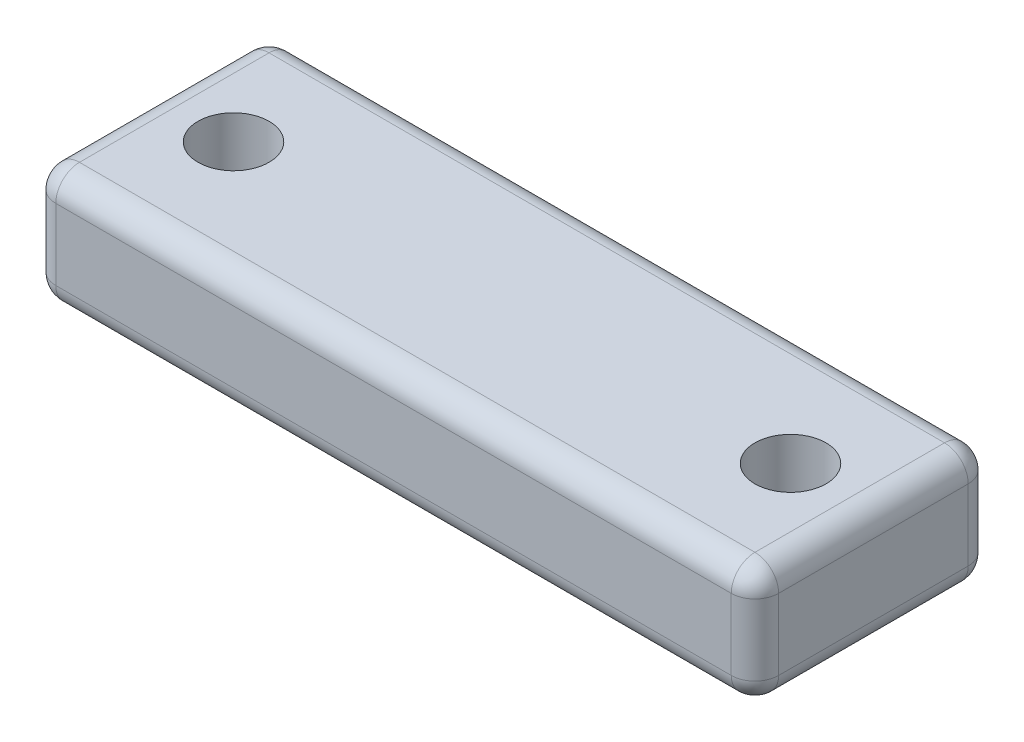
ISO-10303-21;
HEADER;
FILE_DESCRIPTION(('STEP AP214'),'2;1');
FILE_NAME('part.step','',(''),(''),'','','');
FILE_SCHEMA(('AUTOMOTIVE_DESIGN { 1 0 10303 214 1 1 1 1 }'));
ENDSEC;
DATA;
#1=APPLICATION_CONTEXT('core data for automotive mechanical design processes');
#2=APPLICATION_PROTOCOL_DEFINITION('international standard','automotive_design',2000,#1);
#3=PRODUCT_CONTEXT('',#1,'mechanical');
#4=PRODUCT('Part','Part','',(#3));
#5=PRODUCT_RELATED_PRODUCT_CATEGORY('part','',(#4));
#6=PRODUCT_DEFINITION_FORMATION('','',#4);
#7=PRODUCT_DEFINITION_CONTEXT('part definition',#1,'design');
#8=PRODUCT_DEFINITION('design','',#6,#7);
#9=PRODUCT_DEFINITION_SHAPE('','',#8);
#10=(LENGTH_UNIT() NAMED_UNIT(*) SI_UNIT(.MILLI.,.METRE.));
#11=(NAMED_UNIT(*) PLANE_ANGLE_UNIT() SI_UNIT($,.RADIAN.));
#12=(NAMED_UNIT(*) SI_UNIT($,.STERADIAN.) SOLID_ANGLE_UNIT());
#13=UNCERTAINTY_MEASURE_WITH_UNIT(LENGTH_MEASURE(1.E-05),#10,'distance_accuracy_value','');
#14=(GEOMETRIC_REPRESENTATION_CONTEXT(3) GLOBAL_UNCERTAINTY_ASSIGNED_CONTEXT((#13)) GLOBAL_UNIT_ASSIGNED_CONTEXT((#10,
#11,#12)) REPRESENTATION_CONTEXT('',''));
#15=CARTESIAN_POINT('',(0.,0.,0.));
#16=DIRECTION('',(0.,0.,1.));
#17=DIRECTION('',(1.,0.,0.));
#18=AXIS2_PLACEMENT_3D('',#15,#16,#17);
#19=CARTESIAN_POINT('',(0.,5.,0.));
#20=DIRECTION('',(-1.,0.,0.));
#21=DIRECTION('',(0.,0.,1.));
#22=AXIS2_PLACEMENT_3D('',#19,#20,#21);
#23=PLANE('',#22);
#24=DIRECTION('',(0.,0.,-1.));
#25=VECTOR('',#24,1.);
#26=CARTESIAN_POINT('',(0.,1.,0.));
#27=LINE('',#26,#25);
#28=CARTESIAN_POINT('',(0.,1.,-1.));
#29=VERTEX_POINT('',#28);
#30=CARTESIAN_POINT('',(0.,1.,-9.));
#31=VERTEX_POINT('',#30);
#32=EDGE_CURVE('E175',#29,#31,#27,.T.);
#33=ORIENTED_EDGE('',*,*,#32,.T.);
#34=DIRECTION('',(0.,-1.,0.));
#35=VECTOR('',#34,1.);
#36=CARTESIAN_POINT('',(0.,5.,-9.));
#37=LINE('',#36,#35);
#38=CARTESIAN_POINT('',(0.,4.,-9.));
#39=VERTEX_POINT('',#38);
#40=EDGE_CURVE('E180',#31,#39,#37,.F.);
#41=ORIENTED_EDGE('',*,*,#40,.T.);
#42=DIRECTION('',(0.,0.,-1.));
#43=VECTOR('',#42,1.);
#44=CARTESIAN_POINT('',(0.,4.,0.));
#45=LINE('',#44,#43);
#46=CARTESIAN_POINT('',(0.,4.,-1.));
#47=VERTEX_POINT('',#46);
#48=EDGE_CURVE('E177',#39,#47,#45,.F.);
#49=ORIENTED_EDGE('',*,*,#48,.T.);
#50=DIRECTION('',(0.,-1.,0.));
#51=VECTOR('',#50,1.);
#52=CARTESIAN_POINT('',(0.,5.,-1.));
#53=LINE('',#52,#51);
#54=EDGE_CURVE('E173',#47,#29,#53,.T.);
#55=ORIENTED_EDGE('',*,*,#54,.T.);
#56=EDGE_LOOP('',(#33,#41,#49,#55));
#57=FACE_BOUND('',#56,.T.);
#58=ADVANCED_FACE('F39',(#57),#23,.F.);
#59=CARTESIAN_POINT('',(0.,5.,-10.));
#60=DIRECTION('',(0.,0.,1.));
#61=DIRECTION('',(1.,0.,0.));
#62=AXIS2_PLACEMENT_3D('',#59,#60,#61);
#63=PLANE('',#62);
#64=DIRECTION('',(-1.,0.,0.));
#65=VECTOR('',#64,1.);
#66=CARTESIAN_POINT('',(0.,4.,-10.));
#67=LINE('',#66,#65);
#68=CARTESIAN_POINT('',(-29.5,4.,-10.));
#69=VERTEX_POINT('',#68);
#70=CARTESIAN_POINT('',(-1.,4.,-10.));
#71=VERTEX_POINT('',#70);
#72=EDGE_CURVE('E195',#69,#71,#67,.F.);
#73=ORIENTED_EDGE('',*,*,#72,.T.);
#74=DIRECTION('',(0.,-1.,0.));
#75=VECTOR('',#74,1.);
#76=CARTESIAN_POINT('',(-1.,5.,-10.));
#77=LINE('',#76,#75);
#78=CARTESIAN_POINT('',(-1.,1.,-10.));
#79=VERTEX_POINT('',#78);
#80=EDGE_CURVE('E197',#71,#79,#77,.T.);
#81=ORIENTED_EDGE('',*,*,#80,.T.);
#82=DIRECTION('',(-1.,0.,0.));
#83=VECTOR('',#82,1.);
#84=CARTESIAN_POINT('',(0.,1.,-10.));
#85=LINE('',#84,#83);
#86=CARTESIAN_POINT('',(-29.5,1.,-10.));
#87=VERTEX_POINT('',#86);
#88=EDGE_CURVE('E193',#79,#87,#85,.T.);
#89=ORIENTED_EDGE('',*,*,#88,.T.);
#90=DIRECTION('',(0.,-1.,0.));
#91=VECTOR('',#90,1.);
#92=CARTESIAN_POINT('',(-29.5,5.,-10.));
#93=LINE('',#92,#91);
#94=EDGE_CURVE('E191',#87,#69,#93,.F.);
#95=ORIENTED_EDGE('',*,*,#94,.T.);
#96=EDGE_LOOP('',(#73,#81,#89,#95));
#97=FACE_BOUND('',#96,.T.);
#98=ADVANCED_FACE('F298',(#97),#63,.F.);
#99=CARTESIAN_POINT('',(-30.5,5.,0.));
#100=DIRECTION('',(1.,0.,0.));
#101=DIRECTION('',(0.,0.,-1.));
#102=AXIS2_PLACEMENT_3D('',#99,#100,#101);
#103=PLANE('',#102);
#104=DIRECTION('',(0.,0.,1.));
#105=VECTOR('',#104,1.);
#106=CARTESIAN_POINT('',(-30.5,4.,-10.));
#107=LINE('',#106,#105);
#108=CARTESIAN_POINT('',(-30.5,4.,-0.999999999999997));
#109=VERTEX_POINT('',#108);
#110=CARTESIAN_POINT('',(-30.5,4.,-9.));
#111=VERTEX_POINT('',#110);
#112=EDGE_CURVE('E145',#109,#111,#107,.F.);
#113=ORIENTED_EDGE('',*,*,#112,.T.);
#114=DIRECTION('',(0.,-1.,0.));
#115=VECTOR('',#114,1.);
#116=CARTESIAN_POINT('',(-30.5,5.,-9.));
#117=LINE('',#116,#115);
#118=CARTESIAN_POINT('',(-30.5,1.,-9.));
#119=VERTEX_POINT('',#118);
#120=EDGE_CURVE('E205',#111,#119,#117,.T.);
#121=ORIENTED_EDGE('',*,*,#120,.T.);
#122=DIRECTION('',(0.,0.,1.));
#123=VECTOR('',#122,1.);
#124=CARTESIAN_POINT('',(-30.5,1.,0.));
#125=LINE('',#124,#123);
#126=CARTESIAN_POINT('',(-30.5,1.,-0.999999999999997));
#127=VERTEX_POINT('',#126);
#128=EDGE_CURVE('E202',#119,#127,#125,.T.);
#129=ORIENTED_EDGE('',*,*,#128,.T.);
#130=DIRECTION('',(0.,-1.,0.));
#131=VECTOR('',#130,1.);
#132=CARTESIAN_POINT('',(-30.5,5.,-0.999999999999997));
#133=LINE('',#132,#131);
#134=EDGE_CURVE('E200',#127,#109,#133,.F.);
#135=ORIENTED_EDGE('',*,*,#134,.T.);
#136=EDGE_LOOP('',(#113,#121,#129,#135));
#137=FACE_BOUND('',#136,.T.);
#138=ADVANCED_FACE('F294',(#137),#103,.F.);
#139=CARTESIAN_POINT('',(0.,5.,0.));
#140=DIRECTION('',(0.,0.,-1.));
#141=DIRECTION('',(-1.,0.,0.));
#142=AXIS2_PLACEMENT_3D('',#139,#140,#141);
#143=PLANE('',#142);
#144=DIRECTION('',(1.,0.,0.));
#145=VECTOR('',#144,1.);
#146=CARTESIAN_POINT('',(-30.5,4.,0.));
#147=LINE('',#146,#145);
#148=CARTESIAN_POINT('',(-1.,4.,0.));
#149=VERTEX_POINT('',#148);
#150=CARTESIAN_POINT('',(-29.5,4.,0.));
#151=VERTEX_POINT('',#150);
#152=EDGE_CURVE('E48',#149,#151,#147,.F.);
#153=ORIENTED_EDGE('',*,*,#152,.T.);
#154=DIRECTION('',(0.,-1.,0.));
#155=VECTOR('',#154,1.);
#156=CARTESIAN_POINT('',(-29.5,5.,0.));
#157=LINE('',#156,#155);
#158=CARTESIAN_POINT('',(-29.5,1.,0.));
#159=VERTEX_POINT('',#158);
#160=EDGE_CURVE('E11',#151,#159,#157,.T.);
#161=ORIENTED_EDGE('',*,*,#160,.T.);
#162=DIRECTION('',(1.,0.,0.));
#163=VECTOR('',#162,1.);
#164=CARTESIAN_POINT('',(0.,1.,0.));
#165=LINE('',#164,#163);
#166=CARTESIAN_POINT('',(-1.,1.,0.));
#167=VERTEX_POINT('',#166);
#168=EDGE_CURVE('E208',#159,#167,#165,.T.);
#169=ORIENTED_EDGE('',*,*,#168,.T.);
#170=DIRECTION('',(0.,-1.,0.));
#171=VECTOR('',#170,1.);
#172=CARTESIAN_POINT('',(-1.,5.,0.));
#173=LINE('',#172,#171);
#174=EDGE_CURVE('E59',#167,#149,#173,.F.);
#175=ORIENTED_EDGE('',*,*,#174,.T.);
#176=EDGE_LOOP('',(#153,#161,#169,#175));
#177=FACE_BOUND('',#176,.T.);
#178=ADVANCED_FACE('F286',(#177),#143,.F.);
#179=CARTESIAN_POINT('',(0.,5.,0.));
#180=DIRECTION('',(0.,1.,0.));
#181=DIRECTION('',(0.,0.,1.));
#182=AXIS2_PLACEMENT_3D('',#179,#180,#181);
#183=PLANE('',#182);
#184=DIRECTION('',(1.,0.,0.));
#185=VECTOR('',#184,1.);
#186=CARTESIAN_POINT('',(0.,5.,-1.));
#187=LINE('',#186,#185);
#188=CARTESIAN_POINT('',(-29.5,5.,-0.999999999999997));
#189=VERTEX_POINT('',#188);
#190=CARTESIAN_POINT('',(-1.,5.,-1.));
#191=VERTEX_POINT('',#190);
#192=EDGE_CURVE('E132',#189,#191,#187,.T.);
#193=ORIENTED_EDGE('',*,*,#192,.T.);
#194=DIRECTION('',(0.,0.,-1.));
#195=VECTOR('',#194,1.);
#196=CARTESIAN_POINT('',(-1.,5.,-10.));
#197=LINE('',#196,#195);
#198=CARTESIAN_POINT('',(-1.,5.,-9.));
#199=VERTEX_POINT('',#198);
#200=EDGE_CURVE('E171',#191,#199,#197,.T.);
#201=ORIENTED_EDGE('',*,*,#200,.T.);
#202=DIRECTION('',(-1.,0.,0.));
#203=VECTOR('',#202,1.);
#204=CARTESIAN_POINT('',(-30.5,5.,-9.));
#205=LINE('',#204,#203);
#206=CARTESIAN_POINT('',(-29.5,5.,-9.));
#207=VERTEX_POINT('',#206);
#208=EDGE_CURVE('E135',#199,#207,#205,.T.);
#209=ORIENTED_EDGE('',*,*,#208,.T.);
#210=DIRECTION('',(0.,0.,1.));
#211=VECTOR('',#210,1.);
#212=CARTESIAN_POINT('',(-29.5,5.,0.));
#213=LINE('',#212,#211);
#214=EDGE_CURVE('E126',#207,#189,#213,.T.);
#215=ORIENTED_EDGE('',*,*,#214,.T.);
#216=EDGE_LOOP('',(#193,#201,#209,#215));
#217=FACE_BOUND('',#216,.T.);
#218=CARTESIAN_POINT('',(-27.,5.,-5.));
#219=DIRECTION('',(0.,1.,0.));
#220=DIRECTION('',(0.,0.,1.));
#221=AXIS2_PLACEMENT_3D('',#218,#219,#220);
#222=CIRCLE('',#221,1.5);
#223=CARTESIAN_POINT('',(-27.,5.,-3.5));
#224=VERTEX_POINT('',#223);
#225=EDGE_CURVE('E163',#224,#224,#222,.T.);
#226=ORIENTED_EDGE('',*,*,#225,.F.);
#227=EDGE_LOOP('',(#226));
#228=FACE_BOUND('',#227,.T.);
#229=CARTESIAN_POINT('',(-3.5,5.,-5.));
#230=DIRECTION('',(0.,1.,0.));
#231=DIRECTION('',(0.,0.,1.));
#232=AXIS2_PLACEMENT_3D('',#229,#230,#231);
#233=CIRCLE('',#232,1.5);
#234=CARTESIAN_POINT('',(-3.5,5.,-3.5));
#235=VERTEX_POINT('',#234);
#236=EDGE_CURVE('E166',#235,#235,#233,.T.);
#237=ORIENTED_EDGE('',*,*,#236,.F.);
#238=EDGE_LOOP('',(#237));
#239=FACE_BOUND('',#238,.T.);
#240=ADVANCED_FACE('F128',(#217,#228,#239),#183,.T.);
#241=CARTESIAN_POINT('',(0.,0.,0.));
#242=DIRECTION('',(0.,1.,0.));
#243=DIRECTION('',(0.,0.,1.));
#244=AXIS2_PLACEMENT_3D('',#241,#242,#243);
#245=PLANE('',#244);
#246=DIRECTION('',(-1.,0.,0.));
#247=VECTOR('',#246,1.);
#248=CARTESIAN_POINT('',(0.,0.,-9.));
#249=LINE('',#248,#247);
#250=CARTESIAN_POINT('',(-29.5,0.,-9.));
#251=VERTEX_POINT('',#250);
#252=CARTESIAN_POINT('',(-1.,0.,-9.));
#253=VERTEX_POINT('',#252);
#254=EDGE_CURVE('E186',#251,#253,#249,.F.);
#255=ORIENTED_EDGE('',*,*,#254,.T.);
#256=DIRECTION('',(0.,0.,-1.));
#257=VECTOR('',#256,1.);
#258=CARTESIAN_POINT('',(-1.,0.,0.));
#259=LINE('',#258,#257);
#260=CARTESIAN_POINT('',(-1.,0.,-1.));
#261=VERTEX_POINT('',#260);
#262=EDGE_CURVE('E188',#253,#261,#259,.F.);
#263=ORIENTED_EDGE('',*,*,#262,.T.);
#264=DIRECTION('',(1.,0.,0.));
#265=VECTOR('',#264,1.);
#266=CARTESIAN_POINT('',(0.,0.,-1.));
#267=LINE('',#266,#265);
#268=CARTESIAN_POINT('',(-29.5,0.,-0.999999999999997));
#269=VERTEX_POINT('',#268);
#270=EDGE_CURVE('E182',#261,#269,#267,.F.);
#271=ORIENTED_EDGE('',*,*,#270,.T.);
#272=DIRECTION('',(0.,0.,1.));
#273=VECTOR('',#272,1.);
#274=CARTESIAN_POINT('',(-29.5,0.,0.));
#275=LINE('',#274,#273);
#276=EDGE_CURVE('E184',#269,#251,#275,.F.);
#277=ORIENTED_EDGE('',*,*,#276,.T.);
#278=EDGE_LOOP('',(#255,#263,#271,#277));
#279=FACE_BOUND('',#278,.T.);
#280=CARTESIAN_POINT('',(-27.,0.,-5.));
#281=DIRECTION('',(0.,1.,0.));
#282=DIRECTION('',(0.,0.,1.));
#283=AXIS2_PLACEMENT_3D('',#280,#281,#282);
#284=CIRCLE('',#283,1.5);
#285=CARTESIAN_POINT('',(-27.,0.,-3.5));
#286=VERTEX_POINT('',#285);
#287=EDGE_CURVE('E272',#286,#286,#284,.T.);
#288=ORIENTED_EDGE('',*,*,#287,.T.);
#289=EDGE_LOOP('',(#288));
#290=FACE_BOUND('',#289,.T.);
#291=CARTESIAN_POINT('',(-3.5,0.,-5.));
#292=DIRECTION('',(0.,1.,0.));
#293=DIRECTION('',(0.,0.,1.));
#294=AXIS2_PLACEMENT_3D('',#291,#292,#293);
#295=CIRCLE('',#294,1.5);
#296=CARTESIAN_POINT('',(-3.5,0.,-3.5));
#297=VERTEX_POINT('',#296);
#298=EDGE_CURVE('E266',#297,#297,#295,.T.);
#299=ORIENTED_EDGE('',*,*,#298,.T.);
#300=EDGE_LOOP('',(#299));
#301=FACE_BOUND('',#300,.T.);
#302=ADVANCED_FACE('F285',(#279,#290,#301),#245,.F.);
#303=CARTESIAN_POINT('',(-3.5,0.,-5.));
#304=DIRECTION('',(0.,1.,0.));
#305=DIRECTION('',(0.,0.,1.));
#306=AXIS2_PLACEMENT_3D('',#303,#304,#305);
#307=CYLINDRICAL_SURFACE('',#306,1.5);
#308=ORIENTED_EDGE('',*,*,#236,.T.);
#309=EDGE_LOOP('',(#308));
#310=FACE_BOUND('',#309,.T.);
#311=ORIENTED_EDGE('',*,*,#298,.F.);
#312=EDGE_LOOP('',(#311));
#313=FACE_BOUND('',#312,.T.);
#314=ADVANCED_FACE('F281',(#310,#313),#307,.F.);
#315=CARTESIAN_POINT('',(-27.,0.,-5.));
#316=DIRECTION('',(0.,1.,0.));
#317=DIRECTION('',(0.,0.,1.));
#318=AXIS2_PLACEMENT_3D('',#315,#316,#317);
#319=CYLINDRICAL_SURFACE('',#318,1.5);
#320=ORIENTED_EDGE('',*,*,#225,.T.);
#321=EDGE_LOOP('',(#320));
#322=FACE_BOUND('',#321,.T.);
#323=ORIENTED_EDGE('',*,*,#287,.F.);
#324=EDGE_LOOP('',(#323));
#325=FACE_BOUND('',#324,.T.);
#326=ADVANCED_FACE('F378',(#322,#325),#319,.F.);
#327=CARTESIAN_POINT('',(-29.5,1.,0.));
#328=DIRECTION('',(0.,0.,1.));
#329=DIRECTION('',(1.,0.,0.));
#330=AXIS2_PLACEMENT_3D('',#327,#328,#329);
#331=CYLINDRICAL_SURFACE('',#330,1.);
#332=CARTESIAN_POINT('',(-29.5,1.,-0.999999999999997));
#333=DIRECTION('',(0.,0.,1.));
#334=DIRECTION('',(0.,-1.,0.));
#335=AXIS2_PLACEMENT_3D('',#332,#333,#334);
#336=CIRCLE('',#335,1.);
#337=EDGE_CURVE('E43',#127,#269,#336,.T.);
#338=ORIENTED_EDGE('',*,*,#337,.F.);
#339=ORIENTED_EDGE('',*,*,#128,.F.);
#340=CARTESIAN_POINT('',(-29.5,1.,-9.));
#341=DIRECTION('',(0.,0.,-1.));
#342=DIRECTION('',(-1.,0.,0.));
#343=AXIS2_PLACEMENT_3D('',#340,#341,#342);
#344=CIRCLE('',#343,1.);
#345=EDGE_CURVE('E258',#251,#119,#344,.T.);
#346=ORIENTED_EDGE('',*,*,#345,.F.);
#347=ORIENTED_EDGE('',*,*,#276,.F.);
#348=EDGE_LOOP('',(#338,#339,#346,#347));
#349=FACE_BOUND('',#348,.T.);
#350=ADVANCED_FACE('F41',(#349),#331,.T.);
#351=CARTESIAN_POINT('',(-29.5,1.,-0.999999999999997));
#352=DIRECTION('',(0.,-1.,0.));
#353=DIRECTION('',(0.,0.,-1.));
#354=AXIS2_PLACEMENT_3D('',#351,#352,#353);
#355=SPHERICAL_SURFACE('',#354,1.);
#356=CARTESIAN_POINT('',(-29.5,1.,-0.999999999999997));
#357=DIRECTION('',(0.,-1.,0.));
#358=DIRECTION('',(0.,0.,-1.));
#359=AXIS2_PLACEMENT_3D('',#356,#357,#358);
#360=CIRCLE('',#359,1.);
#361=EDGE_CURVE('E253',#127,#159,#360,.F.);
#362=ORIENTED_EDGE('',*,*,#361,.F.);
#363=ORIENTED_EDGE('',*,*,#337,.T.);
#364=CARTESIAN_POINT('',(-29.5,1.,-0.999999999999997));
#365=DIRECTION('',(-1.,0.,0.));
#366=DIRECTION('',(0.,0.,1.));
#367=AXIS2_PLACEMENT_3D('',#364,#365,#366);
#368=CIRCLE('',#367,1.);
#369=EDGE_CURVE('E256',#159,#269,#368,.F.);
#370=ORIENTED_EDGE('',*,*,#369,.F.);
#371=EDGE_LOOP('',(#362,#363,#370));
#372=FACE_BOUND('',#371,.T.);
#373=ADVANCED_FACE('F373',(#372),#355,.T.);
#374=CARTESIAN_POINT('',(-29.5,1.,-9.));
#375=DIRECTION('',(-1.,0.,0.));
#376=DIRECTION('',(0.,0.,1.));
#377=AXIS2_PLACEMENT_3D('',#374,#375,#376);
#378=SPHERICAL_SURFACE('',#377,1.);
#379=CARTESIAN_POINT('',(-29.5,1.,-9.));
#380=DIRECTION('',(-1.,0.,0.));
#381=DIRECTION('',(0.,0.,1.));
#382=AXIS2_PLACEMENT_3D('',#379,#380,#381);
#383=CIRCLE('',#382,1.);
#384=EDGE_CURVE('E248',#251,#87,#383,.F.);
#385=ORIENTED_EDGE('',*,*,#384,.F.);
#386=ORIENTED_EDGE('',*,*,#345,.T.);
#387=CARTESIAN_POINT('',(-29.5,1.,-9.));
#388=DIRECTION('',(0.,-1.,0.));
#389=DIRECTION('',(0.,0.,-1.));
#390=AXIS2_PLACEMENT_3D('',#387,#388,#389);
#391=CIRCLE('',#390,1.);
#392=EDGE_CURVE('E251',#87,#119,#391,.F.);
#393=ORIENTED_EDGE('',*,*,#392,.F.);
#394=EDGE_LOOP('',(#385,#386,#393));
#395=FACE_BOUND('',#394,.T.);
#396=ADVANCED_FACE('F370',(#395),#378,.T.);
#397=CARTESIAN_POINT('',(0.,1.,-1.));
#398=DIRECTION('',(1.,0.,0.));
#399=DIRECTION('',(0.,0.,-1.));
#400=AXIS2_PLACEMENT_3D('',#397,#398,#399);
#401=CYLINDRICAL_SURFACE('',#400,1.);
#402=ORIENTED_EDGE('',*,*,#369,.T.);
#403=ORIENTED_EDGE('',*,*,#270,.F.);
#404=CARTESIAN_POINT('',(-1.,1.,-1.));
#405=DIRECTION('',(1.,0.,0.));
#406=DIRECTION('',(0.,0.,-1.));
#407=AXIS2_PLACEMENT_3D('',#404,#405,#406);
#408=CIRCLE('',#407,1.);
#409=EDGE_CURVE('E243',#167,#261,#408,.T.);
#410=ORIENTED_EDGE('',*,*,#409,.F.);
#411=ORIENTED_EDGE('',*,*,#168,.F.);
#412=EDGE_LOOP('',(#402,#403,#410,#411));
#413=FACE_BOUND('',#412,.T.);
#414=ADVANCED_FACE('F366',(#413),#401,.T.);
#415=CARTESIAN_POINT('',(-29.5,5.,-0.999999999999997));
#416=DIRECTION('',(0.,-1.,0.));
#417=DIRECTION('',(0.,0.,-1.));
#418=AXIS2_PLACEMENT_3D('',#415,#416,#417);
#419=CYLINDRICAL_SURFACE('',#418,1.);
#420=ORIENTED_EDGE('',*,*,#361,.T.);
#421=ORIENTED_EDGE('',*,*,#160,.F.);
#422=CARTESIAN_POINT('',(-29.5,4.,-0.999999999999997));
#423=DIRECTION('',(0.,1.,0.));
#424=DIRECTION('',(0.,0.,1.));
#425=AXIS2_PLACEMENT_3D('',#422,#423,#424);
#426=CIRCLE('',#425,1.);
#427=EDGE_CURVE('E149',#109,#151,#426,.T.);
#428=ORIENTED_EDGE('',*,*,#427,.F.);
#429=ORIENTED_EDGE('',*,*,#134,.F.);
#430=EDGE_LOOP('',(#420,#421,#428,#429));
#431=FACE_BOUND('',#430,.T.);
#432=ADVANCED_FACE('F363',(#431),#419,.T.);
#433=CARTESIAN_POINT('',(-29.5,4.,0.));
#434=DIRECTION('',(0.,0.,-1.));
#435=DIRECTION('',(-1.,0.,0.));
#436=AXIS2_PLACEMENT_3D('',#433,#434,#435);
#437=CYLINDRICAL_SURFACE('',#436,1.);
#438=CARTESIAN_POINT('',(-29.5,4.,-9.));
#439=DIRECTION('',(0.,0.,-1.));
#440=DIRECTION('',(-1.,0.,0.));
#441=AXIS2_PLACEMENT_3D('',#438,#439,#440);
#442=CIRCLE('',#441,1.);
#443=EDGE_CURVE('E150',#111,#207,#442,.T.);
#444=ORIENTED_EDGE('',*,*,#443,.F.);
#445=ORIENTED_EDGE('',*,*,#112,.F.);
#446=CARTESIAN_POINT('',(-29.5,4.,-0.999999999999997));
#447=DIRECTION('',(0.,0.,1.));
#448=DIRECTION('',(1.,0.,0.));
#449=AXIS2_PLACEMENT_3D('',#446,#447,#448);
#450=CIRCLE('',#449,1.);
#451=EDGE_CURVE('E142',#189,#109,#450,.T.);
#452=ORIENTED_EDGE('',*,*,#451,.F.);
#453=ORIENTED_EDGE('',*,*,#214,.F.);
#454=EDGE_LOOP('',(#444,#445,#452,#453));
#455=FACE_BOUND('',#454,.T.);
#456=ADVANCED_FACE('F144',(#455),#437,.T.);
#457=CARTESIAN_POINT('',(-29.5,5.,-9.));
#458=DIRECTION('',(0.,-1.,0.));
#459=DIRECTION('',(0.,0.,-1.));
#460=AXIS2_PLACEMENT_3D('',#457,#458,#459);
#461=CYLINDRICAL_SURFACE('',#460,1.);
#462=ORIENTED_EDGE('',*,*,#392,.T.);
#463=ORIENTED_EDGE('',*,*,#120,.F.);
#464=CARTESIAN_POINT('',(-29.5,4.,-9.));
#465=DIRECTION('',(0.,1.,0.));
#466=DIRECTION('',(0.,0.,1.));
#467=AXIS2_PLACEMENT_3D('',#464,#465,#466);
#468=CIRCLE('',#467,1.);
#469=EDGE_CURVE('E238',#69,#111,#468,.T.);
#470=ORIENTED_EDGE('',*,*,#469,.F.);
#471=ORIENTED_EDGE('',*,*,#94,.F.);
#472=EDGE_LOOP('',(#462,#463,#470,#471));
#473=FACE_BOUND('',#472,.T.);
#474=ADVANCED_FACE('F356',(#473),#461,.T.);
#475=CARTESIAN_POINT('',(0.,1.,-9.));
#476=DIRECTION('',(-1.,0.,0.));
#477=DIRECTION('',(0.,0.,1.));
#478=AXIS2_PLACEMENT_3D('',#475,#476,#477);
#479=CYLINDRICAL_SURFACE('',#478,1.);
#480=ORIENTED_EDGE('',*,*,#384,.T.);
#481=ORIENTED_EDGE('',*,*,#88,.F.);
#482=CARTESIAN_POINT('',(-1.,1.,-9.));
#483=DIRECTION('',(1.,0.,0.));
#484=DIRECTION('',(0.,0.,-1.));
#485=AXIS2_PLACEMENT_3D('',#482,#483,#484);
#486=CIRCLE('',#485,1.);
#487=EDGE_CURVE('E235',#253,#79,#486,.T.);
#488=ORIENTED_EDGE('',*,*,#487,.F.);
#489=ORIENTED_EDGE('',*,*,#254,.F.);
#490=EDGE_LOOP('',(#480,#481,#488,#489));
#491=FACE_BOUND('',#490,.T.);
#492=ADVANCED_FACE('F352',(#491),#479,.T.);
#493=CARTESIAN_POINT('',(-1.,1.,0.));
#494=DIRECTION('',(0.,0.,-1.));
#495=DIRECTION('',(-1.,0.,0.));
#496=AXIS2_PLACEMENT_3D('',#493,#494,#495);
#497=CYLINDRICAL_SURFACE('',#496,1.);
#498=CARTESIAN_POINT('',(-1.,1.,-1.));
#499=DIRECTION('',(0.,0.,1.));
#500=DIRECTION('',(1.,0.,0.));
#501=AXIS2_PLACEMENT_3D('',#498,#499,#500);
#502=CIRCLE('',#501,1.);
#503=EDGE_CURVE('E245',#261,#29,#502,.T.);
#504=ORIENTED_EDGE('',*,*,#503,.F.);
#505=ORIENTED_EDGE('',*,*,#262,.F.);
#506=CARTESIAN_POINT('',(-1.,1.,-9.));
#507=DIRECTION('',(0.,0.,-1.));
#508=DIRECTION('',(-1.,0.,0.));
#509=AXIS2_PLACEMENT_3D('',#506,#507,#508);
#510=CIRCLE('',#509,1.);
#511=EDGE_CURVE('E232',#31,#253,#510,.T.);
#512=ORIENTED_EDGE('',*,*,#511,.F.);
#513=ORIENTED_EDGE('',*,*,#32,.F.);
#514=EDGE_LOOP('',(#504,#505,#512,#513));
#515=FACE_BOUND('',#514,.T.);
#516=ADVANCED_FACE('F348',(#515),#497,.T.);
#517=CARTESIAN_POINT('',(-1.,1.,-1.));
#518=DIRECTION('',(0.,-1.,0.));
#519=DIRECTION('',(0.,0.,-1.));
#520=AXIS2_PLACEMENT_3D('',#517,#518,#519);
#521=SPHERICAL_SURFACE('',#520,1.);
#522=ORIENTED_EDGE('',*,*,#409,.T.);
#523=ORIENTED_EDGE('',*,*,#503,.T.);
#524=CARTESIAN_POINT('',(-1.,1.,-1.));
#525=DIRECTION('',(0.,-1.,0.));
#526=DIRECTION('',(0.,0.,-1.));
#527=AXIS2_PLACEMENT_3D('',#524,#525,#526);
#528=CIRCLE('',#527,1.);
#529=EDGE_CURVE('E156',#167,#29,#528,.F.);
#530=ORIENTED_EDGE('',*,*,#529,.F.);
#531=EDGE_LOOP('',(#522,#523,#530));
#532=FACE_BOUND('',#531,.T.);
#533=ADVANCED_FACE('F345',(#532),#521,.T.);
#534=CARTESIAN_POINT('',(-29.5,4.,-0.999999999999997));
#535=DIRECTION('',(-1.,0.,0.));
#536=DIRECTION('',(0.,0.,1.));
#537=AXIS2_PLACEMENT_3D('',#534,#535,#536);
#538=SPHERICAL_SURFACE('',#537,1.);
#539=ORIENTED_EDGE('',*,*,#451,.T.);
#540=ORIENTED_EDGE('',*,*,#427,.T.);
#541=CARTESIAN_POINT('',(-29.5,4.,-0.999999999999997));
#542=DIRECTION('',(-1.,0.,0.));
#543=DIRECTION('',(0.,0.,1.));
#544=AXIS2_PLACEMENT_3D('',#541,#542,#543);
#545=CIRCLE('',#544,1.);
#546=EDGE_CURVE('E153',#189,#151,#545,.F.);
#547=ORIENTED_EDGE('',*,*,#546,.F.);
#548=EDGE_LOOP('',(#539,#540,#547));
#549=FACE_BOUND('',#548,.T.);
#550=ADVANCED_FACE('F154',(#549),#538,.T.);
#551=CARTESIAN_POINT('',(-29.5,4.,-9.));
#552=DIRECTION('',(-1.,0.,0.));
#553=DIRECTION('',(0.,0.,1.));
#554=AXIS2_PLACEMENT_3D('',#551,#552,#553);
#555=SPHERICAL_SURFACE('',#554,1.);
#556=ORIENTED_EDGE('',*,*,#469,.T.);
#557=ORIENTED_EDGE('',*,*,#443,.T.);
#558=CARTESIAN_POINT('',(-29.5,4.,-9.));
#559=DIRECTION('',(-1.,0.,0.));
#560=DIRECTION('',(0.,0.,1.));
#561=AXIS2_PLACEMENT_3D('',#558,#559,#560);
#562=CIRCLE('',#561,1.);
#563=EDGE_CURVE('E157',#69,#207,#562,.F.);
#564=ORIENTED_EDGE('',*,*,#563,.F.);
#565=EDGE_LOOP('',(#556,#557,#564));
#566=FACE_BOUND('',#565,.T.);
#567=ADVANCED_FACE('F338',(#566),#555,.T.);
#568=CARTESIAN_POINT('',(-1.,1.,-9.));
#569=DIRECTION('',(0.,-1.,0.));
#570=DIRECTION('',(0.,0.,-1.));
#571=AXIS2_PLACEMENT_3D('',#568,#569,#570);
#572=SPHERICAL_SURFACE('',#571,1.);
#573=ORIENTED_EDGE('',*,*,#511,.T.);
#574=ORIENTED_EDGE('',*,*,#487,.T.);
#575=CARTESIAN_POINT('',(-1.,1.,-9.));
#576=DIRECTION('',(0.,-1.,0.));
#577=DIRECTION('',(0.,0.,-1.));
#578=AXIS2_PLACEMENT_3D('',#575,#576,#577);
#579=CIRCLE('',#578,1.);
#580=EDGE_CURVE('E226',#31,#79,#579,.F.);
#581=ORIENTED_EDGE('',*,*,#580,.F.);
#582=EDGE_LOOP('',(#573,#574,#581));
#583=FACE_BOUND('',#582,.T.);
#584=ADVANCED_FACE('F334',(#583),#572,.T.);
#585=CARTESIAN_POINT('',(-1.,5.,-1.));
#586=DIRECTION('',(0.,-1.,0.));
#587=DIRECTION('',(0.,0.,-1.));
#588=AXIS2_PLACEMENT_3D('',#585,#586,#587);
#589=CYLINDRICAL_SURFACE('',#588,1.);
#590=ORIENTED_EDGE('',*,*,#529,.T.);
#591=ORIENTED_EDGE('',*,*,#54,.F.);
#592=CARTESIAN_POINT('',(-1.,4.,-1.));
#593=DIRECTION('',(0.,1.,0.));
#594=DIRECTION('',(0.,0.,1.));
#595=AXIS2_PLACEMENT_3D('',#592,#593,#594);
#596=CIRCLE('',#595,1.);
#597=EDGE_CURVE('E223',#149,#47,#596,.T.);
#598=ORIENTED_EDGE('',*,*,#597,.F.);
#599=ORIENTED_EDGE('',*,*,#174,.F.);
#600=EDGE_LOOP('',(#590,#591,#598,#599));
#601=FACE_BOUND('',#600,.T.);
#602=ADVANCED_FACE('F331',(#601),#589,.T.);
#603=CARTESIAN_POINT('',(0.,4.,-1.));
#604=DIRECTION('',(-1.,0.,0.));
#605=DIRECTION('',(0.,0.,1.));
#606=AXIS2_PLACEMENT_3D('',#603,#604,#605);
#607=CYLINDRICAL_SURFACE('',#606,1.);
#608=ORIENTED_EDGE('',*,*,#546,.T.);
#609=ORIENTED_EDGE('',*,*,#152,.F.);
#610=CARTESIAN_POINT('',(-1.,4.,-1.));
#611=DIRECTION('',(1.,0.,0.));
#612=DIRECTION('',(0.,0.,-1.));
#613=AXIS2_PLACEMENT_3D('',#610,#611,#612);
#614=CIRCLE('',#613,1.);
#615=EDGE_CURVE('E161',#191,#149,#614,.T.);
#616=ORIENTED_EDGE('',*,*,#615,.F.);
#617=ORIENTED_EDGE('',*,*,#192,.F.);
#618=EDGE_LOOP('',(#608,#609,#616,#617));
#619=FACE_BOUND('',#618,.T.);
#620=ADVANCED_FACE('F159',(#619),#607,.T.);
#621=CARTESIAN_POINT('',(0.,4.,-9.));
#622=DIRECTION('',(1.,0.,0.));
#623=DIRECTION('',(0.,0.,-1.));
#624=AXIS2_PLACEMENT_3D('',#621,#622,#623);
#625=CYLINDRICAL_SURFACE('',#624,1.);
#626=ORIENTED_EDGE('',*,*,#563,.T.);
#627=ORIENTED_EDGE('',*,*,#208,.F.);
#628=CARTESIAN_POINT('',(-1.,4.,-9.));
#629=DIRECTION('',(1.,0.,0.));
#630=DIRECTION('',(0.,0.,-1.));
#631=AXIS2_PLACEMENT_3D('',#628,#629,#630);
#632=CIRCLE('',#631,1.);
#633=EDGE_CURVE('E219',#71,#199,#632,.T.);
#634=ORIENTED_EDGE('',*,*,#633,.F.);
#635=ORIENTED_EDGE('',*,*,#72,.F.);
#636=EDGE_LOOP('',(#626,#627,#634,#635));
#637=FACE_BOUND('',#636,.T.);
#638=ADVANCED_FACE('F324',(#637),#625,.T.);
#639=CARTESIAN_POINT('',(-1.,5.,-9.));
#640=DIRECTION('',(0.,-1.,0.));
#641=DIRECTION('',(0.,0.,-1.));
#642=AXIS2_PLACEMENT_3D('',#639,#640,#641);
#643=CYLINDRICAL_SURFACE('',#642,1.);
#644=ORIENTED_EDGE('',*,*,#580,.T.);
#645=ORIENTED_EDGE('',*,*,#80,.F.);
#646=CARTESIAN_POINT('',(-1.,4.,-9.));
#647=DIRECTION('',(0.,1.,0.));
#648=DIRECTION('',(0.,0.,1.));
#649=AXIS2_PLACEMENT_3D('',#646,#647,#648);
#650=CIRCLE('',#649,1.);
#651=EDGE_CURVE('E216',#39,#71,#650,.T.);
#652=ORIENTED_EDGE('',*,*,#651,.F.);
#653=ORIENTED_EDGE('',*,*,#40,.F.);
#654=EDGE_LOOP('',(#644,#645,#652,#653));
#655=FACE_BOUND('',#654,.T.);
#656=ADVANCED_FACE('F320',(#655),#643,.T.);
#657=CARTESIAN_POINT('',(-1.,4.,-1.));
#658=DIRECTION('',(0.,0.,1.));
#659=DIRECTION('',(1.,0.,0.));
#660=AXIS2_PLACEMENT_3D('',#657,#658,#659);
#661=SPHERICAL_SURFACE('',#660,1.);
#662=ORIENTED_EDGE('',*,*,#615,.T.);
#663=ORIENTED_EDGE('',*,*,#597,.T.);
#664=CARTESIAN_POINT('',(-1.,4.,-1.));
#665=DIRECTION('',(0.,0.,1.));
#666=DIRECTION('',(1.,0.,0.));
#667=AXIS2_PLACEMENT_3D('',#664,#665,#666);
#668=CIRCLE('',#667,1.);
#669=EDGE_CURVE('E214',#191,#47,#668,.F.);
#670=ORIENTED_EDGE('',*,*,#669,.F.);
#671=EDGE_LOOP('',(#662,#663,#670));
#672=FACE_BOUND('',#671,.T.);
#673=ADVANCED_FACE('F316',(#672),#661,.T.);
#674=CARTESIAN_POINT('',(-1.,4.,-9.));
#675=DIRECTION('',(0.,0.,-1.));
#676=DIRECTION('',(-1.,0.,0.));
#677=AXIS2_PLACEMENT_3D('',#674,#675,#676);
#678=SPHERICAL_SURFACE('',#677,1.);
#679=ORIENTED_EDGE('',*,*,#651,.T.);
#680=ORIENTED_EDGE('',*,*,#633,.T.);
#681=CARTESIAN_POINT('',(-1.,4.,-9.));
#682=DIRECTION('',(0.,0.,-1.));
#683=DIRECTION('',(-1.,0.,0.));
#684=AXIS2_PLACEMENT_3D('',#681,#682,#683);
#685=CIRCLE('',#684,1.);
#686=EDGE_CURVE('E212',#39,#199,#685,.F.);
#687=ORIENTED_EDGE('',*,*,#686,.F.);
#688=EDGE_LOOP('',(#679,#680,#687));
#689=FACE_BOUND('',#688,.T.);
#690=ADVANCED_FACE('F312',(#689),#678,.T.);
#691=CARTESIAN_POINT('',(-1.,4.,0.));
#692=DIRECTION('',(0.,0.,1.));
#693=DIRECTION('',(1.,0.,0.));
#694=AXIS2_PLACEMENT_3D('',#691,#692,#693);
#695=CYLINDRICAL_SURFACE('',#694,1.);
#696=ORIENTED_EDGE('',*,*,#669,.T.);
#697=ORIENTED_EDGE('',*,*,#48,.F.);
#698=ORIENTED_EDGE('',*,*,#686,.T.);
#699=ORIENTED_EDGE('',*,*,#200,.F.);
#700=EDGE_LOOP('',(#696,#697,#698,#699));
#701=FACE_BOUND('',#700,.T.);
#702=ADVANCED_FACE('F309',(#701),#695,.T.);
#703=CLOSED_SHELL('',(#58,#98,#138,#178,#240,#302,#314,#326,#350,#373,#396,#414,#432,#456,#474,
#492,#516,#533,#550,#567,#584,#602,#620,#638,#656,#673,#690,#702));
#704=MANIFOLD_SOLID_BREP('B2',#703);
#705=ADVANCED_BREP_SHAPE_REPRESENTATION('',(#18,#704),#14);
#706=SHAPE_DEFINITION_REPRESENTATION(#9,#705);
ENDSEC;
END-ISO-10303-21;
